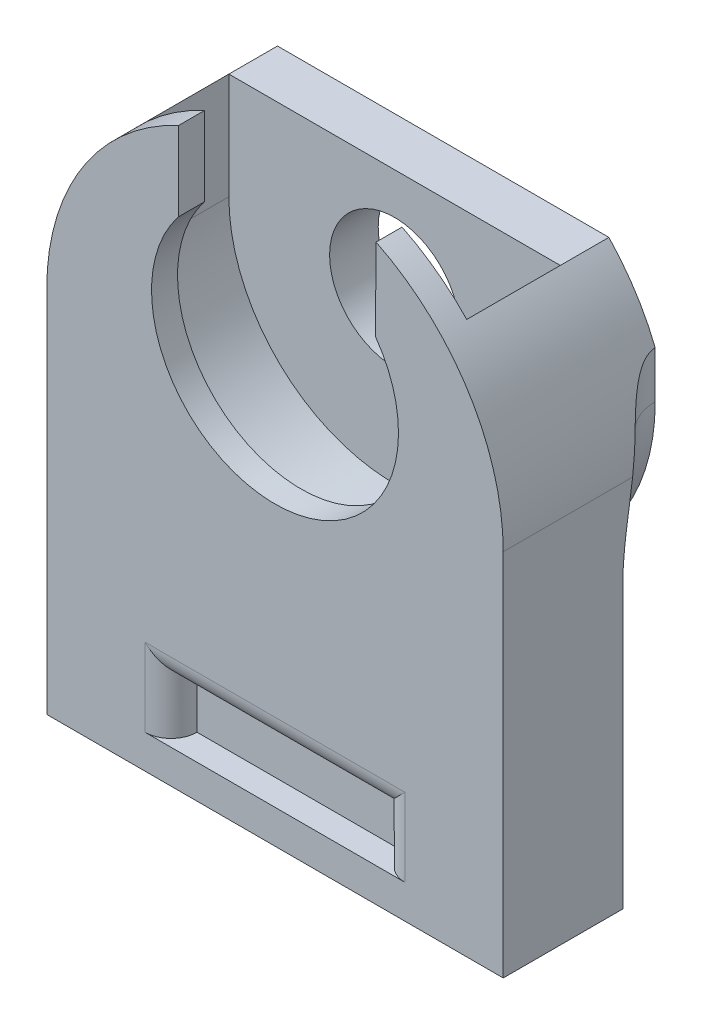
ISO-10303-21;
HEADER;
FILE_DESCRIPTION(('STEP AP214'),'2;1');
FILE_NAME('part.step','',(''),(''),'','','');
FILE_SCHEMA(('AUTOMOTIVE_DESIGN { 1 0 10303 214 1 1 1 1 }'));
ENDSEC;
DATA;
#1=APPLICATION_CONTEXT('core data for automotive mechanical design processes');
#2=APPLICATION_PROTOCOL_DEFINITION('international standard','automotive_design',2000,#1);
#3=PRODUCT_CONTEXT('',#1,'mechanical');
#4=PRODUCT('Part','Part','',(#3));
#5=PRODUCT_RELATED_PRODUCT_CATEGORY('part','',(#4));
#6=PRODUCT_DEFINITION_FORMATION('','',#4);
#7=PRODUCT_DEFINITION_CONTEXT('part definition',#1,'design');
#8=PRODUCT_DEFINITION('design','',#6,#7);
#9=PRODUCT_DEFINITION_SHAPE('','',#8);
#10=(LENGTH_UNIT() NAMED_UNIT(*) SI_UNIT(.MILLI.,.METRE.));
#11=(NAMED_UNIT(*) PLANE_ANGLE_UNIT() SI_UNIT($,.RADIAN.));
#12=(NAMED_UNIT(*) SI_UNIT($,.STERADIAN.) SOLID_ANGLE_UNIT());
#13=UNCERTAINTY_MEASURE_WITH_UNIT(LENGTH_MEASURE(1.E-05),#10,'distance_accuracy_value','');
#14=(GEOMETRIC_REPRESENTATION_CONTEXT(3) GLOBAL_UNCERTAINTY_ASSIGNED_CONTEXT((#13)) GLOBAL_UNIT_ASSIGNED_CONTEXT((#10,
#11,#12)) REPRESENTATION_CONTEXT('',''));
#15=CARTESIAN_POINT('',(0.,0.,0.));
#16=DIRECTION('',(0.,0.,1.));
#17=DIRECTION('',(1.,0.,0.));
#18=AXIS2_PLACEMENT_3D('',#15,#16,#17);
#19=CARTESIAN_POINT('',(8.78,8.5,3.6));
#20=DIRECTION('',(0.,0.,-1.));
#21=DIRECTION('',(-1.,0.,0.));
#22=AXIS2_PLACEMENT_3D('',#19,#20,#21);
#23=CYLINDRICAL_SURFACE('',#22,6.375);
#24=DIRECTION('',(0.,0.,-1.));
#25=VECTOR('',#24,1.);
#26=CARTESIAN_POINT('',(2.405,8.5,17.7427331163393));
#27=LINE('',#26,#25);
#28=CARTESIAN_POINT('',(2.405,8.5,3.6));
#29=VERTEX_POINT('',#28);
#30=CARTESIAN_POINT('',(2.405,8.5,0.));
#31=VERTEX_POINT('',#30);
#32=EDGE_CURVE('E245',#29,#31,#27,.T.);
#33=ORIENTED_EDGE('',*,*,#32,.F.);
#34=CARTESIAN_POINT('',(8.78,8.5,3.6));
#35=DIRECTION('',(0.,0.,1.));
#36=DIRECTION('',(1.,0.,0.));
#37=AXIS2_PLACEMENT_3D('',#34,#35,#36);
#38=CIRCLE('',#37,6.375);
#39=CARTESIAN_POINT('',(15.155,8.49999999999995,3.6));
#40=VERTEX_POINT('',#39);
#41=EDGE_CURVE('E264',#29,#40,#38,.T.);
#42=ORIENTED_EDGE('',*,*,#41,.T.);
#43=DIRECTION('',(0.,0.,-1.));
#44=VECTOR('',#43,1.);
#45=CARTESIAN_POINT('',(15.155,8.49999999999995,17.7427331163393));
#46=LINE('',#45,#44);
#47=CARTESIAN_POINT('',(15.155,8.49999999999995,0.));
#48=VERTEX_POINT('',#47);
#49=EDGE_CURVE('E250',#40,#48,#46,.T.);
#50=ORIENTED_EDGE('',*,*,#49,.T.);
#51=CARTESIAN_POINT('',(8.78,8.5,0.));
#52=DIRECTION('',(0.,0.,1.));
#53=DIRECTION('',(1.,0.,0.));
#54=AXIS2_PLACEMENT_3D('',#51,#52,#53);
#55=CIRCLE('',#54,6.375);
#56=EDGE_CURVE('E296',#31,#48,#55,.T.);
#57=ORIENTED_EDGE('',*,*,#56,.F.);
#58=EDGE_LOOP('',(#33,#42,#50,#57));
#59=FACE_BOUND('',#58,.T.);
#60=ADVANCED_FACE('F34',(#59),#23,.F.);
#61=CARTESIAN_POINT('',(0.,0.,0.));
#62=DIRECTION('',(0.,0.,1.));
#63=DIRECTION('',(1.,0.,0.));
#64=AXIS2_PLACEMENT_3D('',#61,#62,#63);
#65=PLANE('',#64);
#66=DIRECTION('',(1.,0.,0.));
#67=VECTOR('',#66,1.);
#68=CARTESIAN_POINT('',(0.,-1.87,0.));
#69=LINE('',#68,#67);
#70=CARTESIAN_POINT('',(8.62337998923574,-1.87,0.));
#71=VERTEX_POINT('',#70);
#72=CARTESIAN_POINT('',(8.93662001076427,-1.87,0.));
#73=VERTEX_POINT('',#72);
#74=EDGE_CURVE('E361',#71,#73,#69,.T.);
#75=ORIENTED_EDGE('',*,*,#74,.T.);
#76=CARTESIAN_POINT('',(8.93662001076427,8.,0.));
#77=DIRECTION('',(0.,0.,1.));
#78=DIRECTION('',(1.,0.,0.));
#79=AXIS2_PLACEMENT_3D('',#76,#77,#78);
#80=CIRCLE('',#79,9.87);
#81=CARTESIAN_POINT('',(17.56,3.19851923243998,0.));
#82=VERTEX_POINT('',#81);
#83=EDGE_CURVE('E210',#73,#82,#80,.T.);
#84=ORIENTED_EDGE('',*,*,#83,.T.);
#85=DIRECTION('',(0.,1.,0.));
#86=VECTOR('',#85,1.);
#87=CARTESIAN_POINT('',(17.56,0.,0.));
#88=LINE('',#87,#86);
#89=CARTESIAN_POINT('',(17.56,-7.65,0.));
#90=VERTEX_POINT('',#89);
#91=EDGE_CURVE('E300',#90,#82,#88,.T.);
#92=ORIENTED_EDGE('',*,*,#91,.F.);
#93=DIRECTION('',(1.,0.,0.));
#94=VECTOR('',#93,1.);
#95=CARTESIAN_POINT('',(0.,-7.65,0.));
#96=LINE('',#95,#94);
#97=CARTESIAN_POINT('',(0.,-7.65,0.));
#98=VERTEX_POINT('',#97);
#99=EDGE_CURVE('E320',#98,#90,#96,.T.);
#100=ORIENTED_EDGE('',*,*,#99,.F.);
#101=DIRECTION('',(0.,1.,0.));
#102=VECTOR('',#101,1.);
#103=CARTESIAN_POINT('',(0.,0.,0.));
#104=LINE('',#103,#102);
#105=CARTESIAN_POINT('',(0.,3.19851923243999,0.));
#106=VERTEX_POINT('',#105);
#107=EDGE_CURVE('E306',#98,#106,#104,.T.);
#108=ORIENTED_EDGE('',*,*,#107,.T.);
#109=CARTESIAN_POINT('',(8.62337998923574,8.,0.));
#110=DIRECTION('',(0.,0.,1.));
#111=DIRECTION('',(1.,0.,0.));
#112=AXIS2_PLACEMENT_3D('',#109,#110,#111);
#113=CIRCLE('',#112,9.87);
#114=EDGE_CURVE('E359',#106,#71,#113,.T.);
#115=ORIENTED_EDGE('',*,*,#114,.T.);
#116=EDGE_LOOP('',(#75,#84,#92,#100,#108,#115));
#117=FACE_BOUND('',#116,.T.);
#118=ADVANCED_FACE('F434',(#117),#65,.F.);
#119=CARTESIAN_POINT('',(0.,0.,3.6));
#120=DIRECTION('',(0.,0.,1.));
#121=DIRECTION('',(1.,0.,0.));
#122=AXIS2_PLACEMENT_3D('',#119,#120,#121);
#123=PLANE('',#122);
#124=ORIENTED_EDGE('',*,*,#41,.F.);
#125=DIRECTION('',(0.,1.,0.));
#126=VECTOR('',#125,1.);
#127=CARTESIAN_POINT('',(2.405,8.5,3.6));
#128=LINE('',#127,#126);
#129=CARTESIAN_POINT('',(2.405,12.5871992678725,3.6));
#130=VERTEX_POINT('',#129);
#131=EDGE_CURVE('E251',#29,#130,#128,.T.);
#132=ORIENTED_EDGE('',*,*,#131,.T.);
#133=CARTESIAN_POINT('',(8.78,6.55,3.6));
#134=DIRECTION('',(0.,0.,1.));
#135=DIRECTION('',(1.,0.,0.));
#136=AXIS2_PLACEMENT_3D('',#133,#134,#135);
#137=CIRCLE('',#136,8.78);
#138=CARTESIAN_POINT('',(5.07,14.5076566902575,3.6));
#139=VERTEX_POINT('',#138);
#140=EDGE_CURVE('E261',#139,#130,#137,.T.);
#141=ORIENTED_EDGE('',*,*,#140,.F.);
#142=DIRECTION('',(0.,1.,0.));
#143=VECTOR('',#142,1.);
#144=CARTESIAN_POINT('',(5.07,0.,3.6));
#145=LINE('',#144,#143);
#146=CARTESIAN_POINT('',(5.07,11.466209702634,3.6));
#147=VERTEX_POINT('',#146);
#148=EDGE_CURVE('E273',#147,#139,#145,.T.);
#149=ORIENTED_EDGE('',*,*,#148,.F.);
#150=CARTESIAN_POINT('',(8.78,8.5,3.6));
#151=DIRECTION('',(0.,0.,-1.));
#152=DIRECTION('',(-1.,0.,0.));
#153=AXIS2_PLACEMENT_3D('',#150,#151,#152);
#154=CIRCLE('',#153,4.75);
#155=CARTESIAN_POINT('',(12.642805753353,11.2642777920939,3.6));
#156=VERTEX_POINT('',#155);
#157=EDGE_CURVE('E302',#156,#147,#154,.T.);
#158=ORIENTED_EDGE('',*,*,#157,.F.);
#159=DIRECTION('',(-0.00807220354177865,-0.999967419234237,0.));
#160=VECTOR('',#159,1.);
#161=CARTESIAN_POINT('',(12.5510573615878,-0.101317990704999,3.6));
#162=LINE('',#161,#160);
#163=CARTESIAN_POINT('',(12.6682969564391,14.4220738549982,3.6));
#164=VERTEX_POINT('',#163);
#165=EDGE_CURVE('E339',#164,#156,#162,.T.);
#166=ORIENTED_EDGE('',*,*,#165,.F.);
#167=CARTESIAN_POINT('',(8.78,6.55,3.6));
#168=DIRECTION('',(0.,0.,1.));
#169=DIRECTION('',(1.,0.,0.));
#170=AXIS2_PLACEMENT_3D('',#167,#168,#169);
#171=CIRCLE('',#170,8.78);
#172=CARTESIAN_POINT('',(15.155,12.5871992678725,3.6));
#173=VERTEX_POINT('',#172);
#174=EDGE_CURVE('E258',#173,#164,#171,.T.);
#175=ORIENTED_EDGE('',*,*,#174,.F.);
#176=DIRECTION('',(0.,-1.,0.));
#177=VECTOR('',#176,1.);
#178=CARTESIAN_POINT('',(15.155,8.49999999999995,3.6));
#179=LINE('',#178,#177);
#180=EDGE_CURVE('E248',#173,#40,#179,.T.);
#181=ORIENTED_EDGE('',*,*,#180,.T.);
#182=EDGE_LOOP('',(#124,#132,#141,#149,#158,#166,#175,#181));
#183=FACE_BOUND('',#182,.T.);
#184=ADVANCED_FACE('F439',(#183),#123,.F.);
#185=CARTESIAN_POINT('',(0.,0.,4.6));
#186=DIRECTION('',(0.,0.,1.));
#187=DIRECTION('',(1.,0.,0.));
#188=AXIS2_PLACEMENT_3D('',#185,#186,#187);
#189=PLANE('',#188);
#190=DIRECTION('',(0.,1.,0.));
#191=VECTOR('',#190,1.);
#192=CARTESIAN_POINT('',(13.78,-6.35316683145248,4.6));
#193=LINE('',#192,#191);
#194=CARTESIAN_POINT('',(13.78,-3.35316683145248,4.6));
#195=VERTEX_POINT('',#194);
#196=CARTESIAN_POINT('',(13.78,-6.35316683145248,4.6));
#197=VERTEX_POINT('',#196);
#198=EDGE_CURVE('E293',#195,#197,#193,.F.);
#199=ORIENTED_EDGE('',*,*,#198,.T.);
#200=DIRECTION('',(1.,0.,0.));
#201=VECTOR('',#200,1.);
#202=CARTESIAN_POINT('',(12.78,-6.35316683145248,4.6));
#203=LINE('',#202,#201);
#204=CARTESIAN_POINT('',(3.78,-6.35316683145248,4.6));
#205=VERTEX_POINT('',#204);
#206=EDGE_CURVE('E286',#205,#197,#203,.T.);
#207=ORIENTED_EDGE('',*,*,#206,.F.);
#208=DIRECTION('',(0.,-1.,0.));
#209=VECTOR('',#208,1.);
#210=CARTESIAN_POINT('',(3.78,-4.35316683145248,4.6));
#211=LINE('',#210,#209);
#212=CARTESIAN_POINT('',(3.78,-3.35316683145248,4.6));
#213=VERTEX_POINT('',#212);
#214=EDGE_CURVE('E290',#205,#213,#211,.F.);
#215=ORIENTED_EDGE('',*,*,#214,.T.);
#216=DIRECTION('',(-1.,0.,0.));
#217=VECTOR('',#216,1.);
#218=CARTESIAN_POINT('',(12.78,-3.35316683145248,4.6));
#219=LINE('',#218,#217);
#220=EDGE_CURVE('E292',#213,#195,#219,.F.);
#221=ORIENTED_EDGE('',*,*,#220,.T.);
#222=EDGE_LOOP('',(#199,#207,#215,#221));
#223=FACE_BOUND('',#222,.T.);
#224=CARTESIAN_POINT('',(8.78,6.55,4.6));
#225=DIRECTION('',(0.,0.,1.));
#226=DIRECTION('',(1.,0.,0.));
#227=AXIS2_PLACEMENT_3D('',#224,#225,#226);
#228=CIRCLE('',#227,8.78);
#229=CARTESIAN_POINT('',(17.56,6.55,4.6));
#230=VERTEX_POINT('',#229);
#231=CARTESIAN_POINT('',(12.6682969564391,14.4220738549982,4.6));
#232=VERTEX_POINT('',#231);
#233=EDGE_CURVE('E298',#230,#232,#228,.T.);
#234=ORIENTED_EDGE('',*,*,#233,.T.);
#235=DIRECTION('',(-0.00807220354177865,-0.999967419234237,0.));
#236=VECTOR('',#235,1.);
#237=CARTESIAN_POINT('',(12.6696430470026,14.588824693216,4.6));
#238=LINE('',#237,#236);
#239=CARTESIAN_POINT('',(12.642805753353,11.2642777920939,4.6));
#240=VERTEX_POINT('',#239);
#241=EDGE_CURVE('E344',#232,#240,#238,.T.);
#242=ORIENTED_EDGE('',*,*,#241,.T.);
#243=CARTESIAN_POINT('',(8.78,8.5,4.6));
#244=DIRECTION('',(0.,0.,-1.));
#245=DIRECTION('',(-1.,0.,0.));
#246=AXIS2_PLACEMENT_3D('',#243,#244,#245);
#247=CIRCLE('',#246,4.75);
#248=CARTESIAN_POINT('',(5.07,11.466209702634,4.6));
#249=VERTEX_POINT('',#248);
#250=EDGE_CURVE('E316',#240,#249,#247,.T.);
#251=ORIENTED_EDGE('',*,*,#250,.T.);
#252=DIRECTION('',(0.,-1.,0.));
#253=VECTOR('',#252,1.);
#254=CARTESIAN_POINT('',(5.07,14.6194981256581,4.6));
#255=LINE('',#254,#253);
#256=CARTESIAN_POINT('',(5.07,14.5076566902575,4.6));
#257=VERTEX_POINT('',#256);
#258=EDGE_CURVE('E274',#257,#249,#255,.T.);
#259=ORIENTED_EDGE('',*,*,#258,.F.);
#260=CARTESIAN_POINT('',(8.78,6.55,4.6));
#261=DIRECTION('',(0.,0.,1.));
#262=DIRECTION('',(1.,0.,0.));
#263=AXIS2_PLACEMENT_3D('',#260,#261,#262);
#264=CIRCLE('',#263,8.78);
#265=CARTESIAN_POINT('',(0.,6.55,4.6));
#266=VERTEX_POINT('',#265);
#267=EDGE_CURVE('E314',#257,#266,#264,.T.);
#268=ORIENTED_EDGE('',*,*,#267,.T.);
#269=DIRECTION('',(0.,-1.,0.));
#270=VECTOR('',#269,1.);
#271=CARTESIAN_POINT('',(0.,0.,4.6));
#272=LINE('',#271,#270);
#273=CARTESIAN_POINT('',(0.,-7.65,4.6));
#274=VERTEX_POINT('',#273);
#275=EDGE_CURVE('E312',#266,#274,#272,.T.);
#276=ORIENTED_EDGE('',*,*,#275,.T.);
#277=DIRECTION('',(-1.,0.,0.));
#278=VECTOR('',#277,1.);
#279=CARTESIAN_POINT('',(17.56,-7.65,4.6));
#280=LINE('',#279,#278);
#281=CARTESIAN_POINT('',(17.56,-7.65,4.6));
#282=VERTEX_POINT('',#281);
#283=EDGE_CURVE('E305',#282,#274,#280,.T.);
#284=ORIENTED_EDGE('',*,*,#283,.F.);
#285=DIRECTION('',(0.,1.,0.));
#286=VECTOR('',#285,1.);
#287=CARTESIAN_POINT('',(17.56,0.,4.6));
#288=LINE('',#287,#286);
#289=EDGE_CURVE('E309',#282,#230,#288,.T.);
#290=ORIENTED_EDGE('',*,*,#289,.T.);
#291=EDGE_LOOP('',(#234,#242,#251,#259,#268,#276,#284,#290));
#292=FACE_BOUND('',#291,.T.);
#293=ADVANCED_FACE('F501',(#223,#292),#189,.T.);
#294=CARTESIAN_POINT('',(8.78,8.5,4.6));
#295=DIRECTION('',(0.,0.,-1.));
#296=DIRECTION('',(-1.,0.,0.));
#297=AXIS2_PLACEMENT_3D('',#294,#295,#296);
#298=CYLINDRICAL_SURFACE('',#297,4.75);
#299=DIRECTION('',(0.,0.,-1.));
#300=VECTOR('',#299,1.);
#301=CARTESIAN_POINT('',(12.642805753353,11.2642777920939,4.6));
#302=LINE('',#301,#300);
#303=EDGE_CURVE('E269',#156,#240,#302,.F.);
#304=ORIENTED_EDGE('',*,*,#303,.F.);
#305=ORIENTED_EDGE('',*,*,#157,.T.);
#306=DIRECTION('',(0.,0.,-1.));
#307=VECTOR('',#306,1.);
#308=CARTESIAN_POINT('',(5.07,11.466209702634,4.6));
#309=LINE('',#308,#307);
#310=EDGE_CURVE('E270',#249,#147,#309,.T.);
#311=ORIENTED_EDGE('',*,*,#310,.F.);
#312=ORIENTED_EDGE('',*,*,#250,.F.);
#313=EDGE_LOOP('',(#304,#305,#311,#312));
#314=FACE_BOUND('',#313,.T.);
#315=ADVANCED_FACE('F518',(#314),#298,.F.);
#316=CARTESIAN_POINT('',(8.78,6.55,3.6));
#317=DIRECTION('',(0.,0.,-1.));
#318=DIRECTION('',(-1.,0.,0.));
#319=AXIS2_PLACEMENT_3D('',#316,#317,#318);
#320=CYLINDRICAL_SURFACE('',#319,8.78);
#321=DIRECTION('',(0.,0.,-1.));
#322=VECTOR('',#321,1.);
#323=CARTESIAN_POINT('',(17.56,6.55,3.6));
#324=LINE('',#323,#322);
#325=CARTESIAN_POINT('',(17.56,6.55,-0.376678719483411));
#326=VERTEX_POINT('',#325);
#327=EDGE_CURVE('E59',#230,#326,#324,.T.);
#328=ORIENTED_EDGE('',*,*,#327,.T.);
#329=CARTESIAN_POINT('',(17.56,6.55,-0.376678719483445));
#330=CARTESIAN_POINT('',(17.5599995270757,6.66973610895043,-0.391645638041362));
#331=CARTESIAN_POINT('',(17.5575499078055,6.78937435326612,-0.407234810052966));
#332=CARTESIAN_POINT('',(17.5477796873859,7.02826719803863,-0.439768312180382));
#333=CARTESIAN_POINT('',(17.5404590764458,7.14752179772382,-0.456712645020031));
#334=CARTESIAN_POINT('',(17.5113769648211,7.50265410910789,-0.509480760214901));
#335=CARTESIAN_POINT('',(17.4824938257514,7.73769074975735,-0.547459631542807));
#336=CARTESIAN_POINT('',(17.4252609706734,8.08680776670218,-0.609613114176489));
#337=CARTESIAN_POINT('',(17.403878029386,8.20255597991153,-0.631184304066382));
#338=CARTESIAN_POINT('',(17.3565660020954,8.43274105437548,-0.676292366924847));
#339=CARTESIAN_POINT('',(17.3306370498483,8.54717795410703,-0.699829182048639));
#340=CARTESIAN_POINT('',(17.2741373097991,8.77529379375256,-0.749320808993638));
#341=CARTESIAN_POINT('',(17.2435341507939,8.88896117754392,-0.775291953461384));
#342=CARTESIAN_POINT('',(17.1779835134062,9.11438686910083,-0.829954321828415));
#343=CARTESIAN_POINT('',(17.1430355157161,9.22614494684141,-0.858645870780813));
#344=CARTESIAN_POINT('',(17.1059976167678,9.33678375292688,-0.888918915727635));
#345=B_SPLINE_CURVE_WITH_KNOTS('',3,(#329,#330,#331,#332,#333,#334,#335,#336,#337,#338,#339,
#340,#341,#342,#343,#344),.UNSPECIFIED.,.F.,.F.,(4,2,2,2,2,2,2,4),(0.,0.361937073233089,
0.723874873967965,1.44235518697129,1.80127359052817,2.16018143548794,2.52169816000887,
2.8832581356654),.UNSPECIFIED.);
#346=CARTESIAN_POINT('',(17.4394399357002,8.,-0.594179227968167));
#347=VERTEX_POINT('',#346);
#348=EDGE_CURVE('E420',#326,#347,#345,.T.);
#349=ORIENTED_EDGE('',*,*,#348,.T.);
#350=CARTESIAN_POINT('',(17.4394399357002,8.,-0.594179227968167));
#351=CARTESIAN_POINT('',(17.4240201477143,8.09216420853565,-0.610769682800152));
#352=CARTESIAN_POINT('',(17.4071539062772,8.18378186530015,-0.629385465180723));
#353=CARTESIAN_POINT('',(17.3707025917869,8.36571335312294,-0.671721198756279));
#354=CARTESIAN_POINT('',(17.3511058571361,8.45601965287677,-0.69546329646079));
#355=CARTESIAN_POINT('',(17.3092925575907,8.63521764844699,-0.749253197482276));
#356=CARTESIAN_POINT('',(17.2870509499401,8.72408498956349,-0.779363791823925));
#357=CARTESIAN_POINT('',(17.2406307952004,8.89823480536989,-0.847124893146833));
#358=CARTESIAN_POINT('',(17.2164562903784,8.98352422073453,-0.884759899634195));
#359=CARTESIAN_POINT('',(17.1743151520761,9.12440726977741,-0.956947590077173));
#360=CARTESIAN_POINT('',(17.1566336450916,9.18130636882367,-0.989104361592063));
#361=CARTESIAN_POINT('',(17.1211909344294,9.2915831086616,-1.05897252352583));
#362=CARTESIAN_POINT('',(17.1034297727723,9.34496241560316,-1.09668125810504));
#363=CARTESIAN_POINT('',(17.068373053547,9.44727853982594,-1.17904065527757));
#364=CARTESIAN_POINT('',(17.0510839156671,9.49616567799601,-1.22375687224273));
#365=CARTESIAN_POINT('',(17.01835071664,9.58648993397231,-1.32081708956083));
#366=CARTESIAN_POINT('',(17.0029026762309,9.62794322063841,-1.37314407567719));
#367=CARTESIAN_POINT('',(16.9803264253447,9.68746589313267,-1.46628621530755));
#368=CARTESIAN_POINT('',(16.972167404397,9.70866689956173,-1.50483604193031));
#369=CARTESIAN_POINT('',(16.9580262367225,9.74510049921371,-1.58495677437085));
#370=CARTESIAN_POINT('',(16.9520380978151,9.7603495304547,-1.62651897830711));
#371=CARTESIAN_POINT('',(16.9427979178744,9.78377433558673,-1.71214376232688));
#372=CARTESIAN_POINT('',(16.9395570966478,9.79192110827591,-1.75621581858425));
#373=CARTESIAN_POINT('',(16.937069836472,9.798170946207,-1.82316883061139));
#374=CARTESIAN_POINT('',(16.9366410219038,9.79924756714121,-1.84576223675738));
#375=CARTESIAN_POINT('',(16.9366004254851,9.79934870398349,-1.8909715245641));
#376=CARTESIAN_POINT('',(16.936989267409,9.79837165318533,-1.9135874102186));
#377=CARTESIAN_POINT('',(16.9377889452524,9.79636404685565,-1.93610936830708));
#378=B_SPLINE_CURVE_WITH_KNOTS('',3,(#350,#351,#352,#353,#354,#355,#356,#357,#358,#359,#360,
#361,#362,#363,#364,#365,#366,#367,#368,#369,#370,#371,#372,#373,#374,#375,#376,#377),
.UNSPECIFIED.,.F.,.F.,(4,2,2,2,2,2,2,2,2,2,2,2,2,4),(0.,0.284774455255104,0.570804717818058,
0.859798851394684,1.14820367212974,1.3510778292827,1.55385525288111,1.75865736940709,
1.96300848452012,2.09678631662166,2.23019202502451,2.36413996150232,2.43191291380336,
2.49973758753633),.UNSPECIFIED.);
#379=CARTESIAN_POINT('',(16.9366200107643,9.79929992459914,-1.87));
#380=VERTEX_POINT('',#379);
#381=EDGE_CURVE('E371',#347,#380,#378,.T.);
#382=ORIENTED_EDGE('',*,*,#381,.T.);
#383=CARTESIAN_POINT('',(8.78,6.55,-1.87));
#384=DIRECTION('',(0.,0.,-1.));
#385=DIRECTION('',(-1.,0.,0.));
#386=AXIS2_PLACEMENT_3D('',#383,#384,#385);
#387=CIRCLE('',#386,8.78);
#388=CARTESIAN_POINT('',(15.155,12.5871992678725,-1.87));
#389=VERTEX_POINT('',#388);
#390=EDGE_CURVE('E230',#389,#380,#387,.T.);
#391=ORIENTED_EDGE('',*,*,#390,.F.);
#392=DIRECTION('',(0.,0.,1.));
#393=VECTOR('',#392,1.);
#394=CARTESIAN_POINT('',(15.155,12.5871992678725,-1.87));
#395=LINE('',#394,#393);
#396=CARTESIAN_POINT('',(15.155,12.5871992678725,0.));
#397=VERTEX_POINT('',#396);
#398=EDGE_CURVE('E233',#389,#397,#395,.T.);
#399=ORIENTED_EDGE('',*,*,#398,.T.);
#400=DIRECTION('',(0.,0.,-1.));
#401=VECTOR('',#400,1.);
#402=CARTESIAN_POINT('',(15.155,12.5871992678725,3.6));
#403=LINE('',#402,#401);
#404=EDGE_CURVE('E356',#397,#173,#403,.F.);
#405=ORIENTED_EDGE('',*,*,#404,.T.);
#406=ORIENTED_EDGE('',*,*,#174,.T.);
#407=DIRECTION('',(0.,0.,-1.));
#408=VECTOR('',#407,1.);
#409=CARTESIAN_POINT('',(12.6682969564391,14.4220738549982,3.6));
#410=LINE('',#409,#408);
#411=EDGE_CURVE('E265',#232,#164,#410,.T.);
#412=ORIENTED_EDGE('',*,*,#411,.F.);
#413=ORIENTED_EDGE('',*,*,#233,.F.);
#414=EDGE_LOOP('',(#328,#349,#382,#391,#399,#405,#406,#412,#413));
#415=FACE_BOUND('',#414,.T.);
#416=ADVANCED_FACE('F456',(#415),#320,.T.);
#417=CARTESIAN_POINT('',(8.78,6.55,3.6));
#418=DIRECTION('',(0.,0.,-1.));
#419=DIRECTION('',(-1.,0.,0.));
#420=AXIS2_PLACEMENT_3D('',#417,#418,#419);
#421=CYLINDRICAL_SURFACE('',#420,8.78);
#422=DIRECTION('',(0.,0.,-1.));
#423=VECTOR('',#422,1.);
#424=CARTESIAN_POINT('',(5.07,14.5076566902575,3.6));
#425=LINE('',#424,#423);
#426=EDGE_CURVE('E282',#139,#257,#425,.F.);
#427=ORIENTED_EDGE('',*,*,#426,.F.);
#428=ORIENTED_EDGE('',*,*,#140,.T.);
#429=DIRECTION('',(0.,0.,-1.));
#430=VECTOR('',#429,1.);
#431=CARTESIAN_POINT('',(2.405,12.5871992678725,3.6));
#432=LINE('',#431,#430);
#433=CARTESIAN_POINT('',(2.405,12.5871992678725,0.));
#434=VERTEX_POINT('',#433);
#435=EDGE_CURVE('E268',#130,#434,#432,.T.);
#436=ORIENTED_EDGE('',*,*,#435,.T.);
#437=DIRECTION('',(0.,0.,1.));
#438=VECTOR('',#437,1.);
#439=CARTESIAN_POINT('',(2.405,12.5871992678725,-1.87));
#440=LINE('',#439,#438);
#441=CARTESIAN_POINT('',(2.405,12.5871992678725,-1.87));
#442=VERTEX_POINT('',#441);
#443=EDGE_CURVE('E239',#442,#434,#440,.T.);
#444=ORIENTED_EDGE('',*,*,#443,.F.);
#445=CARTESIAN_POINT('',(8.78,6.55,-1.87));
#446=DIRECTION('',(0.,0.,-1.));
#447=DIRECTION('',(-1.,0.,0.));
#448=AXIS2_PLACEMENT_3D('',#445,#446,#447);
#449=CIRCLE('',#448,8.78);
#450=CARTESIAN_POINT('',(0.623379989235738,9.79929992459915,-1.87));
#451=VERTEX_POINT('',#450);
#452=EDGE_CURVE('E225',#451,#442,#449,.T.);
#453=ORIENTED_EDGE('',*,*,#452,.F.);
#454=CARTESIAN_POINT('',(0.623033866597427,9.79843092869827,-1.90597747721005));
#455=CARTESIAN_POINT('',(0.623442370415403,9.79945524004539,-1.88486491867912));
#456=CARTESIAN_POINT('',(0.623488986768873,9.79957333133333,-1.86371294709691));
#457=CARTESIAN_POINT('',(0.622869677325945,9.79801902056514,-1.8214995317798));
#458=CARTESIAN_POINT('',(0.622204237176105,9.79634783885312,-1.80043803616791));
#459=CARTESIAN_POINT('',(0.619175760602193,9.78873130972242,-1.73799171700743));
#460=CARTESIAN_POINT('',(0.615787666868241,9.78020100906049,-1.69694431487049));
#461=CARTESIAN_POINT('',(0.606861429435906,9.75754443636021,-1.61906095887728));
#462=CARTESIAN_POINT('',(0.601443262867247,9.7437296639846,-1.58211698559553));
#463=CARTESIAN_POINT('',(0.588882073529437,9.71137469496746,-1.5106224332813));
#464=CARTESIAN_POINT('',(0.581735746814756,9.69282544299987,-1.4760766039021));
#465=CARTESIAN_POINT('',(0.561184095947379,9.63880865760174,-1.38846974900915));
#466=CARTESIAN_POINT('',(0.546695310160557,9.60009976900076,-1.33766582711242));
#467=CARTESIAN_POINT('',(0.515860515399868,9.51554115735401,-1.24306027886824));
#468=CARTESIAN_POINT('',(0.499509722294968,9.46967292223746,-1.19927741935774));
#469=CARTESIAN_POINT('',(0.468549646337193,9.38021074780859,-1.12401833757293));
#470=CARTESIAN_POINT('',(0.454042946530789,9.33729285201679,-1.09168023180533));
#471=CARTESIAN_POINT('',(0.424923284927993,9.24875421554112,-1.03096854349993));
#472=CARTESIAN_POINT('',(0.4103102502053,9.20313142835776,-1.00259801874435));
#473=CARTESIAN_POINT('',(0.366693047192659,9.06281405379796,-0.922442881584671));
#474=CARTESIAN_POINT('',(0.338032218213679,8.96501595520564,-0.875887225380067));
#475=CARTESIAN_POINT('',(0.291673343280348,8.79542483624635,-0.80618548230568));
#476=CARTESIAN_POINT('',(0.273316165724429,8.72489222036799,-0.780244543534506));
#477=CARTESIAN_POINT('',(0.238051384106603,8.58197497142031,-0.732664672577072));
#478=CARTESIAN_POINT('',(0.221144704815106,8.50958919448339,-0.711028473469209));
#479=CARTESIAN_POINT('',(0.189296706592987,8.36483024049467,-0.671804946148625));
#480=CARTESIAN_POINT('',(0.17432471621075,8.29248180111748,-0.65414987966602));
#481=CARTESIAN_POINT('',(0.146119753087781,8.14687817688715,-0.621954903643266));
#482=CARTESIAN_POINT('',(0.13288412886019,8.07362456594919,-0.607410222527541));
#483=CARTESIAN_POINT('',(0.120560064299782,8.00000000000022,-0.59417922796763));
#484=B_SPLINE_CURVE_WITH_KNOTS('',3,(#454,#455,#456,#457,#458,#459,#460,#461,#462,#463,#464,
#465,#466,#467,#468,#469,#470,#471,#472,#473,#474,#475,#476,#477,#478,#479,#480,#481,#482,#483),
.UNSPECIFIED.,.F.,.F.,(4,2,2,2,2,2,2,2,2,2,2,2,2,2,4),(0.,0.0633796509896781,0.126716102455131,
0.252203234505245,0.37121455038993,0.490455219733195,0.6858093216746,0.88167718861925,
1.04841938121939,1.21528938070553,1.55038452986147,1.78234431444937,2.01445090357376,
2.24224642434578,2.46968994140724),.UNSPECIFIED.);
#485=CARTESIAN_POINT('',(0.12056006429977,8.,-0.594179227968166));
#486=VERTEX_POINT('',#485);
#487=EDGE_CURVE('E364',#451,#486,#484,.T.);
#488=ORIENTED_EDGE('',*,*,#487,.T.);
#489=CARTESIAN_POINT('',(0.,6.55,-0.376678719483442));
#490=CARTESIAN_POINT('',(4.7292425595797E-07,6.66973610895043,-0.391645638041359));
#491=CARTESIAN_POINT('',(0.00245009219449367,6.78937435326612,-0.407234810052963));
#492=CARTESIAN_POINT('',(0.0122203126140926,7.02826719803863,-0.439768312180379));
#493=CARTESIAN_POINT('',(0.0195409235542289,7.14752179772382,-0.456712645020028));
#494=CARTESIAN_POINT('',(0.0486230351789418,7.50265410910789,-0.509480760214898));
#495=CARTESIAN_POINT('',(0.0775061742485578,7.73769074975735,-0.547459631542806));
#496=CARTESIAN_POINT('',(0.134739029326587,8.08680776670218,-0.609613114176486));
#497=CARTESIAN_POINT('',(0.156121970613994,8.20255597991153,-0.631184304066378));
#498=CARTESIAN_POINT('',(0.203433997904639,8.43274105437548,-0.676292366924842));
#499=CARTESIAN_POINT('',(0.229362950151703,8.54717795410702,-0.699829182048635));
#500=CARTESIAN_POINT('',(0.28586269020089,8.77529379375256,-0.749320808993634));
#501=CARTESIAN_POINT('',(0.31646584920608,8.88896117754391,-0.775291953461379));
#502=CARTESIAN_POINT('',(0.382016486593757,9.11438686910083,-0.829954321828409));
#503=CARTESIAN_POINT('',(0.416964484283867,9.22614494684141,-0.858645870780808));
#504=CARTESIAN_POINT('',(0.454002383232218,9.33678375292688,-0.888918915727629));
#505=B_SPLINE_CURVE_WITH_KNOTS('',3,(#489,#490,#491,#492,#493,#494,#495,#496,#497,#498,#499,
#500,#501,#502,#503,#504),.UNSPECIFIED.,.F.,.F.,(4,2,2,2,2,2,2,4),(0.,0.361937073233088,
0.723874873967965,1.44235518697129,1.80127359052817,2.16018143548793,2.52169816000886,
2.8832581356654),.UNSPECIFIED.);
#506=CARTESIAN_POINT('',(0.,6.55,-0.376678719483443));
#507=VERTEX_POINT('',#506);
#508=EDGE_CURVE('E44',#486,#507,#505,.F.);
#509=ORIENTED_EDGE('',*,*,#508,.T.);
#510=DIRECTION('',(0.,0.,-1.));
#511=VECTOR('',#510,1.);
#512=CARTESIAN_POINT('',(0.,6.55,3.6));
#513=LINE('',#512,#511);
#514=EDGE_CURVE('E51',#266,#507,#513,.T.);
#515=ORIENTED_EDGE('',*,*,#514,.F.);
#516=ORIENTED_EDGE('',*,*,#267,.F.);
#517=EDGE_LOOP('',(#427,#428,#436,#444,#453,#488,#509,#515,#516));
#518=FACE_BOUND('',#517,.T.);
#519=ADVANCED_FACE('F377',(#518),#421,.T.);
#520=CARTESIAN_POINT('',(0.,0.,3.6));
#521=DIRECTION('',(-1.,0.,0.));
#522=DIRECTION('',(0.,0.,1.));
#523=AXIS2_PLACEMENT_3D('',#520,#521,#522);
#524=PLANE('',#523);
#525=ORIENTED_EDGE('',*,*,#107,.F.);
#526=DIRECTION('',(0.,0.,-1.));
#527=VECTOR('',#526,1.);
#528=CARTESIAN_POINT('',(0.,-7.65,4.6));
#529=LINE('',#528,#527);
#530=EDGE_CURVE('E323',#274,#98,#529,.T.);
#531=ORIENTED_EDGE('',*,*,#530,.F.);
#532=ORIENTED_EDGE('',*,*,#275,.F.);
#533=ORIENTED_EDGE('',*,*,#514,.T.);
#534=CARTESIAN_POINT('',(0.,9.39003904696931,-0.384072071287627));
#535=CARTESIAN_POINT('',(0.,9.26197247969858,-0.399679876672791));
#536=CARTESIAN_POINT('',(0.,9.13369829176319,-0.413811896130697));
#537=CARTESIAN_POINT('',(0.,8.87674089038296,-0.438273971167934));
#538=CARTESIAN_POINT('',(0.,8.74805753520631,-0.448602520526506));
#539=CARTESIAN_POINT('',(0.,8.49087530581128,-0.464563406720382));
#540=CARTESIAN_POINT('',(0.,8.36237756611873,-0.470213307679686));
#541=CARTESIAN_POINT('',(0.,8.10527939970003,-0.476415158960912));
#542=CARTESIAN_POINT('',(0.,7.97667899515306,-0.476968010682018));
#543=CARTESIAN_POINT('',(0.,7.71973888293138,-0.472929977422504));
#544=CARTESIAN_POINT('',(0.,7.59139906063852,-0.468346202629178));
#545=CARTESIAN_POINT('',(0.,7.33497169591002,-0.454436527698084));
#546=CARTESIAN_POINT('',(0.,7.20688417842772,-0.445110180039807));
#547=CARTESIAN_POINT('',(0.,6.95095790706737,-0.422448494896422));
#548=CARTESIAN_POINT('',(0.,6.82311947918092,-0.409109570601237));
#549=CARTESIAN_POINT('',(0.,6.567792414861,-0.37938784685269));
#550=CARTESIAN_POINT('',(0.,6.44030381136241,-0.363004770148432));
#551=CARTESIAN_POINT('',(0.,6.05469186390594,-0.310403086097381));
#552=CARTESIAN_POINT('',(0.,5.79700314477878,-0.271106844605147));
#553=CARTESIAN_POINT('',(0.,5.28177246158251,-0.193214051394781));
#554=CARTESIAN_POINT('',(0.,5.02423057358671,-0.1546169029282));
#555=CARTESIAN_POINT('',(0.,4.50655667368445,-0.0860171930666329));
#556=CARTESIAN_POINT('',(0.,4.24641814952647,-0.0560589240822136));
#557=CARTESIAN_POINT('',(0.,3.85470519890904,-0.0238138818931742));
#558=CARTESIAN_POINT('',(0.,3.72367611172068,-0.0151773896515326));
#559=CARTESIAN_POINT('',(0.,3.4612888794633,-0.00327597100460445));
#560=CARTESIAN_POINT('',(0.,3.3299305672168,-1.48476736124362E-05));
#561=CARTESIAN_POINT('',(0.,3.19851923243999,0.));
#562=B_SPLINE_CURVE_WITH_KNOTS('',3,(#534,#535,#536,#537,#538,#539,#540,#541,#542,#543,#544,
#545,#546,#547,#548,#549,#550,#551,#552,#553,#554,#555,#556,#557,#558,#559,#560,#561),
.UNSPECIFIED.,.F.,.F.,(4,2,2,2,2,2,2,2,2,2,2,2,2,4),(0.,0.387075974620488,0.774305071644094,
1.16007379500537,1.54577429491654,1.93094156178833,2.31614518071016,2.70169415845081,
3.08727826788895,3.869240559263,4.65050050471543,5.43569758828807,5.82953676990201,
6.22365447338184),.UNSPECIFIED.);
#563=EDGE_CURVE('E11',#507,#106,#562,.T.);
#564=ORIENTED_EDGE('',*,*,#563,.T.);
#565=EDGE_LOOP('',(#525,#531,#532,#533,#564));
#566=FACE_BOUND('',#565,.T.);
#567=ADVANCED_FACE('F405',(#566),#524,.T.);
#568=CARTESIAN_POINT('',(17.56,0.,3.6));
#569=DIRECTION('',(-1.,0.,0.));
#570=DIRECTION('',(0.,0.,1.));
#571=AXIS2_PLACEMENT_3D('',#568,#569,#570);
#572=PLANE('',#571);
#573=ORIENTED_EDGE('',*,*,#91,.T.);
#574=CARTESIAN_POINT('',(17.56,9.39003904696959,-0.384072071287595));
#575=CARTESIAN_POINT('',(17.56,9.26197247969885,-0.399679876672762));
#576=CARTESIAN_POINT('',(17.56,9.13369829176346,-0.413811896130671));
#577=CARTESIAN_POINT('',(17.56,8.87674089038321,-0.438273971167915));
#578=CARTESIAN_POINT('',(17.56,8.74805753520656,-0.448602520526491));
#579=CARTESIAN_POINT('',(17.56,8.49087530581152,-0.464563406720374));
#580=CARTESIAN_POINT('',(17.56,8.36237756611896,-0.470213307679682));
#581=CARTESIAN_POINT('',(17.56,8.10527939970025,-0.476415158960913));
#582=CARTESIAN_POINT('',(17.56,7.97667899515328,-0.476968010682022));
#583=CARTESIAN_POINT('',(17.56,7.71973888293159,-0.472929977422513));
#584=CARTESIAN_POINT('',(17.56,7.59139906063872,-0.468346202629191));
#585=CARTESIAN_POINT('',(17.56,7.33497169591021,-0.454436527698101));
#586=CARTESIAN_POINT('',(17.56,7.20688417842791,-0.445110180039824));
#587=CARTESIAN_POINT('',(17.56,6.95095790706754,-0.422448494896442));
#588=CARTESIAN_POINT('',(17.56,6.82311947918108,-0.409109570601257));
#589=CARTESIAN_POINT('',(17.56,6.56779241486115,-0.379387846852712));
#590=CARTESIAN_POINT('',(17.56,6.44030381136256,-0.363004770148455));
#591=CARTESIAN_POINT('',(17.56,6.05469186390607,-0.310403086097404));
#592=CARTESIAN_POINT('',(17.56,5.7970031447789,-0.271106844605168));
#593=CARTESIAN_POINT('',(17.56,5.28177246158261,-0.193214051394797));
#594=CARTESIAN_POINT('',(17.56,5.02423057358679,-0.154616902928213));
#595=CARTESIAN_POINT('',(17.56,4.50655667368451,-0.0860171930666405));
#596=CARTESIAN_POINT('',(17.56,4.24641814952652,-0.0560589240822188));
#597=CARTESIAN_POINT('',(17.56,3.85470519890907,-0.0238138818931767));
#598=CARTESIAN_POINT('',(17.56,3.7236761117207,-0.0151773896515343));
#599=CARTESIAN_POINT('',(17.56,3.46128887946331,-0.00327597100460504));
#600=CARTESIAN_POINT('',(17.56,3.3299305672168,-1.48476736126511E-05));
#601=CARTESIAN_POINT('',(17.56,3.19851923243998,0.));
#602=B_SPLINE_CURVE_WITH_KNOTS('',3,(#574,#575,#576,#577,#578,#579,#580,#581,#582,#583,#584,
#585,#586,#587,#588,#589,#590,#591,#592,#593,#594,#595,#596,#597,#598,#599,#600,#601),
.UNSPECIFIED.,.F.,.F.,(4,2,2,2,2,2,2,2,2,2,2,2,2,4),(0.,0.387075974620505,0.774305071644128,
1.16007379500542,1.54577429491661,1.93094156178841,2.31614518071026,2.70169415845093,
3.08727826788908,3.86924055926318,4.65050050471564,5.43569758828831,5.82953676990228,
6.22365447338213),.UNSPECIFIED.);
#603=EDGE_CURVE('E416',#82,#326,#602,.F.);
#604=ORIENTED_EDGE('',*,*,#603,.T.);
#605=ORIENTED_EDGE('',*,*,#327,.F.);
#606=ORIENTED_EDGE('',*,*,#289,.F.);
#607=DIRECTION('',(0.,0.,1.));
#608=VECTOR('',#607,1.);
#609=CARTESIAN_POINT('',(17.56,-7.65,0.));
#610=LINE('',#609,#608);
#611=EDGE_CURVE('E317',#90,#282,#610,.T.);
#612=ORIENTED_EDGE('',*,*,#611,.F.);
#613=EDGE_LOOP('',(#573,#604,#605,#606,#612));
#614=FACE_BOUND('',#613,.T.);
#615=ADVANCED_FACE('F409',(#614),#572,.F.);
#616=CARTESIAN_POINT('',(0.,-7.65,0.));
#617=DIRECTION('',(0.,-1.,0.));
#618=DIRECTION('',(0.,0.,-1.));
#619=AXIS2_PLACEMENT_3D('',#616,#617,#618);
#620=PLANE('',#619);
#621=ORIENTED_EDGE('',*,*,#283,.T.);
#622=ORIENTED_EDGE('',*,*,#530,.T.);
#623=ORIENTED_EDGE('',*,*,#99,.T.);
#624=ORIENTED_EDGE('',*,*,#611,.T.);
#625=EDGE_LOOP('',(#621,#622,#623,#624));
#626=FACE_BOUND('',#625,.T.);
#627=ADVANCED_FACE('F413',(#626),#620,.T.);
#628=CARTESIAN_POINT('',(12.78,-6.35316683145248,3.6));
#629=DIRECTION('',(0.,-1.,0.));
#630=DIRECTION('',(1.,0.,0.));
#631=AXIS2_PLACEMENT_3D('',#628,#629,#630);
#632=PLANE('',#631);
#633=ORIENTED_EDGE('',*,*,#206,.T.);
#634=CARTESIAN_POINT('',(13.78,-6.35316683145248,3.6));
#635=DIRECTION('',(0.,-1.,0.));
#636=DIRECTION('',(1.,0.,0.));
#637=AXIS2_PLACEMENT_3D('',#634,#635,#636);
#638=CIRCLE('',#637,1.);
#639=CARTESIAN_POINT('',(12.78,-6.35316683145248,3.6));
#640=VERTEX_POINT('',#639);
#641=EDGE_CURVE('E283',#197,#640,#638,.T.);
#642=ORIENTED_EDGE('',*,*,#641,.T.);
#643=DIRECTION('',(1.,0.,0.));
#644=VECTOR('',#643,1.);
#645=CARTESIAN_POINT('',(12.78,-6.35316683145248,3.6));
#646=LINE('',#645,#644);
#647=CARTESIAN_POINT('',(4.78,-6.35316683145248,3.6));
#648=VERTEX_POINT('',#647);
#649=EDGE_CURVE('E279',#648,#640,#646,.T.);
#650=ORIENTED_EDGE('',*,*,#649,.F.);
#651=CARTESIAN_POINT('',(3.78,-6.35316683145248,3.6));
#652=DIRECTION('',(0.,-1.,0.));
#653=DIRECTION('',(1.,0.,0.));
#654=AXIS2_PLACEMENT_3D('',#651,#652,#653);
#655=CIRCLE('',#654,1.);
#656=EDGE_CURVE('E285',#648,#205,#655,.T.);
#657=ORIENTED_EDGE('',*,*,#656,.T.);
#658=EDGE_LOOP('',(#633,#642,#650,#657));
#659=FACE_BOUND('',#658,.T.);
#660=ADVANCED_FACE('F507',(#659),#632,.F.);
#661=CARTESIAN_POINT('',(0.,0.,3.6));
#662=DIRECTION('',(0.,0.,1.));
#663=DIRECTION('',(1.,0.,0.));
#664=AXIS2_PLACEMENT_3D('',#661,#662,#663);
#665=PLANE('',#664);
#666=DIRECTION('',(0.,1.,0.));
#667=VECTOR('',#666,1.);
#668=CARTESIAN_POINT('',(12.78,-6.35316683145248,3.6));
#669=LINE('',#668,#667);
#670=CARTESIAN_POINT('',(12.78,-4.35316683145248,3.6));
#671=VERTEX_POINT('',#670);
#672=EDGE_CURVE('E289',#640,#671,#669,.T.);
#673=ORIENTED_EDGE('',*,*,#672,.T.);
#674=DIRECTION('',(-1.,0.,0.));
#675=VECTOR('',#674,1.);
#676=CARTESIAN_POINT('',(12.78,-4.35316683145248,3.6));
#677=LINE('',#676,#675);
#678=CARTESIAN_POINT('',(4.78,-4.35316683145248,3.6));
#679=VERTEX_POINT('',#678);
#680=EDGE_CURVE('E334',#671,#679,#677,.T.);
#681=ORIENTED_EDGE('',*,*,#680,.T.);
#682=DIRECTION('',(0.,-1.,0.));
#683=VECTOR('',#682,1.);
#684=CARTESIAN_POINT('',(4.78,-6.35316683145248,3.6));
#685=LINE('',#684,#683);
#686=EDGE_CURVE('E331',#679,#648,#685,.T.);
#687=ORIENTED_EDGE('',*,*,#686,.T.);
#688=ORIENTED_EDGE('',*,*,#649,.T.);
#689=EDGE_LOOP('',(#673,#681,#687,#688));
#690=FACE_BOUND('',#689,.T.);
#691=ADVANCED_FACE('F480',(#690),#665,.T.);
#692=CARTESIAN_POINT('',(13.78,-6.35316683145248,3.6));
#693=DIRECTION('',(0.,-1.,0.));
#694=DIRECTION('',(0.,0.,-1.));
#695=AXIS2_PLACEMENT_3D('',#692,#693,#694);
#696=CYLINDRICAL_SURFACE('',#695,1.);
#697=ORIENTED_EDGE('',*,*,#641,.F.);
#698=ORIENTED_EDGE('',*,*,#198,.F.);
#699=CARTESIAN_POINT('',(13.78,-3.35316683145248,3.6));
#700=DIRECTION('',(0.707106781186547,-0.707106781186547,0.));
#701=DIRECTION('',(-0.707106781186547,-0.707106781186547,0.));
#702=AXIS2_PLACEMENT_3D('',#699,#700,#701);
#703=ELLIPSE('',#702,1.41421356237309,1.);
#704=EDGE_CURVE('E275',#671,#195,#703,.F.);
#705=ORIENTED_EDGE('',*,*,#704,.F.);
#706=ORIENTED_EDGE('',*,*,#672,.F.);
#707=EDGE_LOOP('',(#697,#698,#705,#706));
#708=FACE_BOUND('',#707,.T.);
#709=ADVANCED_FACE('F476',(#708),#696,.T.);
#710=CARTESIAN_POINT('',(12.78,-3.35316683145248,3.6));
#711=DIRECTION('',(1.,0.,0.));
#712=DIRECTION('',(0.,0.,-1.));
#713=AXIS2_PLACEMENT_3D('',#710,#711,#712);
#714=CYLINDRICAL_SURFACE('',#713,1.);
#715=ORIENTED_EDGE('',*,*,#704,.T.);
#716=ORIENTED_EDGE('',*,*,#220,.F.);
#717=CARTESIAN_POINT('',(3.78,-3.35316683145248,3.6));
#718=DIRECTION('',(0.707106781186547,0.707106781186547,0.));
#719=DIRECTION('',(-0.707106781186547,0.707106781186547,0.));
#720=AXIS2_PLACEMENT_3D('',#717,#718,#719);
#721=ELLIPSE('',#720,1.41421356237309,1.);
#722=EDGE_CURVE('E278',#679,#213,#721,.F.);
#723=ORIENTED_EDGE('',*,*,#722,.F.);
#724=ORIENTED_EDGE('',*,*,#680,.F.);
#725=EDGE_LOOP('',(#715,#716,#723,#724));
#726=FACE_BOUND('',#725,.T.);
#727=ADVANCED_FACE('F479',(#726),#714,.T.);
#728=CARTESIAN_POINT('',(3.78,-6.35316683145248,3.6));
#729=DIRECTION('',(0.,1.,0.));
#730=DIRECTION('',(0.,0.,1.));
#731=AXIS2_PLACEMENT_3D('',#728,#729,#730);
#732=CYLINDRICAL_SURFACE('',#731,1.);
#733=ORIENTED_EDGE('',*,*,#722,.T.);
#734=ORIENTED_EDGE('',*,*,#214,.F.);
#735=ORIENTED_EDGE('',*,*,#656,.F.);
#736=ORIENTED_EDGE('',*,*,#686,.F.);
#737=EDGE_LOOP('',(#733,#734,#735,#736));
#738=FACE_BOUND('',#737,.T.);
#739=ADVANCED_FACE('F483',(#738),#732,.T.);
#740=CARTESIAN_POINT('',(5.07,0.,0.));
#741=DIRECTION('',(1.,0.,0.));
#742=DIRECTION('',(0.,0.,-1.));
#743=AXIS2_PLACEMENT_3D('',#740,#741,#742);
#744=PLANE('',#743);
#745=ORIENTED_EDGE('',*,*,#148,.T.);
#746=ORIENTED_EDGE('',*,*,#426,.T.);
#747=ORIENTED_EDGE('',*,*,#258,.T.);
#748=ORIENTED_EDGE('',*,*,#310,.T.);
#749=EDGE_LOOP('',(#745,#746,#747,#748));
#750=FACE_BOUND('',#749,.T.);
#751=ADVANCED_FACE('F486',(#750),#744,.T.);
#752=CARTESIAN_POINT('',(12.5516314824536,-0.0301971179980865,0.));
#753=DIRECTION('',(-0.999967419234237,0.00807220354177865,0.));
#754=DIRECTION('',(0.,0.,-1.));
#755=AXIS2_PLACEMENT_3D('',#752,#753,#754);
#756=PLANE('',#755);
#757=ORIENTED_EDGE('',*,*,#411,.T.);
#758=ORIENTED_EDGE('',*,*,#165,.T.);
#759=ORIENTED_EDGE('',*,*,#303,.T.);
#760=ORIENTED_EDGE('',*,*,#241,.F.);
#761=EDGE_LOOP('',(#757,#758,#759,#760));
#762=FACE_BOUND('',#761,.T.);
#763=ADVANCED_FACE('F473',(#762),#756,.T.);
#764=CARTESIAN_POINT('',(15.155,8.49999999999995,17.7427331163393));
#765=DIRECTION('',(1.,0.,0.));
#766=DIRECTION('',(0.,0.,-1.));
#767=AXIS2_PLACEMENT_3D('',#764,#765,#766);
#768=PLANE('',#767);
#769=DIRECTION('',(0.,-1.,0.));
#770=VECTOR('',#769,1.);
#771=CARTESIAN_POINT('',(15.155,8.49999999999995,0.));
#772=LINE('',#771,#770);
#773=EDGE_CURVE('E241',#397,#48,#772,.T.);
#774=ORIENTED_EDGE('',*,*,#773,.T.);
#775=ORIENTED_EDGE('',*,*,#49,.F.);
#776=ORIENTED_EDGE('',*,*,#180,.F.);
#777=ORIENTED_EDGE('',*,*,#404,.F.);
#778=EDGE_LOOP('',(#774,#775,#776,#777));
#779=FACE_BOUND('',#778,.T.);
#780=ADVANCED_FACE('F451',(#779),#768,.F.);
#781=CARTESIAN_POINT('',(2.405,8.5,17.7427331163393));
#782=DIRECTION('',(-1.,0.,0.));
#783=DIRECTION('',(0.,-1.,0.));
#784=AXIS2_PLACEMENT_3D('',#781,#782,#783);
#785=PLANE('',#784);
#786=ORIENTED_EDGE('',*,*,#131,.F.);
#787=ORIENTED_EDGE('',*,*,#32,.T.);
#788=DIRECTION('',(0.,1.,0.));
#789=VECTOR('',#788,1.);
#790=CARTESIAN_POINT('',(2.405,8.5,0.));
#791=LINE('',#790,#789);
#792=EDGE_CURVE('E242',#31,#434,#791,.T.);
#793=ORIENTED_EDGE('',*,*,#792,.T.);
#794=ORIENTED_EDGE('',*,*,#435,.F.);
#795=EDGE_LOOP('',(#786,#787,#793,#794));
#796=FACE_BOUND('',#795,.T.);
#797=ADVANCED_FACE('F465',(#796),#785,.F.);
#798=CARTESIAN_POINT('',(0.,12.5871992678725,-1.87));
#799=DIRECTION('',(0.,1.,0.));
#800=DIRECTION('',(-1.,0.,0.));
#801=AXIS2_PLACEMENT_3D('',#798,#799,#800);
#802=PLANE('',#801);
#803=DIRECTION('',(-1.,0.,0.));
#804=VECTOR('',#803,1.);
#805=CARTESIAN_POINT('',(0.,12.5871992678725,0.));
#806=LINE('',#805,#804);
#807=EDGE_CURVE('E203',#397,#434,#806,.T.);
#808=ORIENTED_EDGE('',*,*,#807,.F.);
#809=ORIENTED_EDGE('',*,*,#398,.F.);
#810=DIRECTION('',(-1.,0.,0.));
#811=VECTOR('',#810,1.);
#812=CARTESIAN_POINT('',(0.,12.5871992678725,-1.87));
#813=LINE('',#812,#811);
#814=EDGE_CURVE('E227',#389,#442,#813,.T.);
#815=ORIENTED_EDGE('',*,*,#814,.T.);
#816=ORIENTED_EDGE('',*,*,#443,.T.);
#817=EDGE_LOOP('',(#808,#809,#815,#816));
#818=FACE_BOUND('',#817,.T.);
#819=ADVANCED_FACE('F459',(#818),#802,.T.);
#820=CARTESIAN_POINT('',(0.,0.,-1.87));
#821=DIRECTION('',(0.,0.,-1.));
#822=DIRECTION('',(-1.,0.,0.));
#823=AXIS2_PLACEMENT_3D('',#820,#821,#822);
#824=PLANE('',#823);
#825=CARTESIAN_POINT('',(8.78,8.5,-1.87));
#826=DIRECTION('',(0.,0.,-1.));
#827=DIRECTION('',(-1.,0.,0.));
#828=AXIS2_PLACEMENT_3D('',#825,#826,#827);
#829=CIRCLE('',#828,2.5);
#830=CARTESIAN_POINT('',(6.28,8.5,-1.87));
#831=VERTEX_POINT('',#830);
#832=EDGE_CURVE('E725',#831,#831,#829,.T.);
#833=ORIENTED_EDGE('',*,*,#832,.F.);
#834=EDGE_LOOP('',(#833));
#835=FACE_BOUND('',#834,.T.);
#836=CARTESIAN_POINT('',(8.93662001076427,8.,-1.87));
#837=DIRECTION('',(0.,0.,-1.));
#838=DIRECTION('',(-1.,0.,0.));
#839=AXIS2_PLACEMENT_3D('',#836,#837,#838);
#840=CIRCLE('',#839,8.);
#841=CARTESIAN_POINT('',(8.93662001076427,0.,-1.87));
#842=VERTEX_POINT('',#841);
#843=CARTESIAN_POINT('',(16.9366200107643,8.,-1.87));
#844=VERTEX_POINT('',#843);
#845=EDGE_CURVE('E191',#842,#844,#840,.F.);
#846=ORIENTED_EDGE('',*,*,#845,.F.);
#847=DIRECTION('',(1.,0.,0.));
#848=VECTOR('',#847,1.);
#849=CARTESIAN_POINT('',(0.,0.,-1.87));
#850=LINE('',#849,#848);
#851=CARTESIAN_POINT('',(8.62337998923574,0.,-1.87));
#852=VERTEX_POINT('',#851);
#853=EDGE_CURVE('E195',#852,#842,#850,.T.);
#854=ORIENTED_EDGE('',*,*,#853,.F.);
#855=CARTESIAN_POINT('',(8.62337998923574,8.,-1.87));
#856=DIRECTION('',(0.,0.,-1.));
#857=DIRECTION('',(-1.,0.,0.));
#858=AXIS2_PLACEMENT_3D('',#855,#856,#857);
#859=CIRCLE('',#858,8.);
#860=CARTESIAN_POINT('',(0.623379989235737,8.,-1.87));
#861=VERTEX_POINT('',#860);
#862=EDGE_CURVE('E217',#861,#852,#859,.F.);
#863=ORIENTED_EDGE('',*,*,#862,.F.);
#864=DIRECTION('',(0.,-1.,0.));
#865=VECTOR('',#864,1.);
#866=CARTESIAN_POINT('',(0.62337998923574,0.,-1.87));
#867=LINE('',#866,#865);
#868=EDGE_CURVE('E219',#451,#861,#867,.T.);
#869=ORIENTED_EDGE('',*,*,#868,.F.);
#870=ORIENTED_EDGE('',*,*,#452,.T.);
#871=ORIENTED_EDGE('',*,*,#814,.F.);
#872=ORIENTED_EDGE('',*,*,#390,.T.);
#873=DIRECTION('',(0.,1.,0.));
#874=VECTOR('',#873,1.);
#875=CARTESIAN_POINT('',(16.9366200107643,0.,-1.87));
#876=LINE('',#875,#874);
#877=EDGE_CURVE('E199',#844,#380,#876,.T.);
#878=ORIENTED_EDGE('',*,*,#877,.F.);
#879=EDGE_LOOP('',(#846,#854,#863,#869,#870,#871,#872,#878));
#880=FACE_BOUND('',#879,.T.);
#881=ADVANCED_FACE('F193',(#835,#880),#824,.T.);
#882=CARTESIAN_POINT('',(0.,0.,0.));
#883=DIRECTION('',(0.,0.,-1.));
#884=DIRECTION('',(-1.,0.,0.));
#885=AXIS2_PLACEMENT_3D('',#882,#883,#884);
#886=PLANE('',#885);
#887=CARTESIAN_POINT('',(8.78,8.5,0.));
#888=DIRECTION('',(0.,0.,-1.));
#889=DIRECTION('',(-1.,0.,0.));
#890=AXIS2_PLACEMENT_3D('',#887,#888,#889);
#891=CIRCLE('',#890,2.5);
#892=CARTESIAN_POINT('',(6.28,8.5,0.));
#893=VERTEX_POINT('',#892);
#894=EDGE_CURVE('E236',#893,#893,#891,.F.);
#895=ORIENTED_EDGE('',*,*,#894,.F.);
#896=EDGE_LOOP('',(#895));
#897=FACE_BOUND('',#896,.T.);
#898=ORIENTED_EDGE('',*,*,#792,.F.);
#899=ORIENTED_EDGE('',*,*,#56,.T.);
#900=ORIENTED_EDGE('',*,*,#773,.F.);
#901=ORIENTED_EDGE('',*,*,#807,.T.);
#902=EDGE_LOOP('',(#898,#899,#900,#901));
#903=FACE_BOUND('',#902,.T.);
#904=ADVANCED_FACE('F453',(#897,#903),#886,.F.);
#905=CARTESIAN_POINT('',(8.78,8.5,4.601));
#906=DIRECTION('',(0.,0.,-1.));
#907=DIRECTION('',(-1.,0.,0.));
#908=AXIS2_PLACEMENT_3D('',#905,#906,#907);
#909=CYLINDRICAL_SURFACE('',#908,2.5);
#910=ORIENTED_EDGE('',*,*,#832,.T.);
#911=EDGE_LOOP('',(#910));
#912=FACE_BOUND('',#911,.T.);
#913=ORIENTED_EDGE('',*,*,#894,.T.);
#914=EDGE_LOOP('',(#913));
#915=FACE_BOUND('',#914,.T.);
#916=ADVANCED_FACE('F431',(#912,#915),#909,.F.);
#917=CARTESIAN_POINT('',(18.8066200107643,0.,-1.87));
#918=DIRECTION('',(0.,1.,0.));
#919=DIRECTION('',(0.,0.,1.));
#920=AXIS2_PLACEMENT_3D('',#917,#918,#919);
#921=CYLINDRICAL_SURFACE('',#920,1.87);
#922=ORIENTED_EDGE('',*,*,#877,.T.);
#923=ORIENTED_EDGE('',*,*,#381,.F.);
#924=CARTESIAN_POINT('',(18.8066200107643,8.,-1.87));
#925=DIRECTION('',(0.,1.,0.));
#926=DIRECTION('',(0.,0.,1.));
#927=AXIS2_PLACEMENT_3D('',#924,#925,#926);
#928=CIRCLE('',#927,1.87);
#929=EDGE_CURVE('E39',#844,#347,#928,.T.);
#930=ORIENTED_EDGE('',*,*,#929,.F.);
#931=EDGE_LOOP('',(#922,#923,#930));
#932=FACE_BOUND('',#931,.T.);
#933=ADVANCED_FACE('F36',(#932),#921,.F.);
#934=CARTESIAN_POINT('',(8.93662001076427,8.,-1.87));
#935=DIRECTION('',(0.,0.,1.));
#936=DIRECTION('',(1.,0.,0.));
#937=AXIS2_PLACEMENT_3D('',#934,#935,#936);
#938=TOROIDAL_SURFACE('',#937,9.87,1.87);
#939=ORIENTED_EDGE('',*,*,#603,.F.);
#940=ORIENTED_EDGE('',*,*,#83,.F.);
#941=CARTESIAN_POINT('',(8.93662001076427,-1.87,-1.87));
#942=DIRECTION('',(1.,0.,0.));
#943=DIRECTION('',(0.,0.,-1.));
#944=AXIS2_PLACEMENT_3D('',#941,#942,#943);
#945=CIRCLE('',#944,1.87);
#946=EDGE_CURVE('E207',#842,#73,#945,.T.);
#947=ORIENTED_EDGE('',*,*,#946,.F.);
#948=ORIENTED_EDGE('',*,*,#845,.T.);
#949=ORIENTED_EDGE('',*,*,#929,.T.);
#950=ORIENTED_EDGE('',*,*,#348,.F.);
#951=EDGE_LOOP('',(#939,#940,#947,#948,#949,#950));
#952=FACE_BOUND('',#951,.T.);
#953=ADVANCED_FACE('F209',(#952),#938,.F.);
#954=CARTESIAN_POINT('',(0.,-1.87,-1.87));
#955=DIRECTION('',(1.,0.,0.));
#956=DIRECTION('',(0.,1.,0.));
#957=AXIS2_PLACEMENT_3D('',#954,#955,#956);
#958=CYLINDRICAL_SURFACE('',#957,1.87);
#959=ORIENTED_EDGE('',*,*,#946,.T.);
#960=ORIENTED_EDGE('',*,*,#74,.F.);
#961=CARTESIAN_POINT('',(8.62337998923574,-1.87,-1.87));
#962=DIRECTION('',(1.,0.,0.));
#963=DIRECTION('',(0.,0.,-1.));
#964=AXIS2_PLACEMENT_3D('',#961,#962,#963);
#965=CIRCLE('',#964,1.87);
#966=EDGE_CURVE('E213',#852,#71,#965,.T.);
#967=ORIENTED_EDGE('',*,*,#966,.F.);
#968=ORIENTED_EDGE('',*,*,#853,.T.);
#969=EDGE_LOOP('',(#959,#960,#967,#968));
#970=FACE_BOUND('',#969,.T.);
#971=ADVANCED_FACE('F214',(#970),#958,.F.);
#972=CARTESIAN_POINT('',(8.62337998923574,8.,-1.87));
#973=DIRECTION('',(0.,0.,1.));
#974=DIRECTION('',(1.,0.,0.));
#975=AXIS2_PLACEMENT_3D('',#972,#973,#974);
#976=TOROIDAL_SURFACE('',#975,9.87,1.87);
#977=ORIENTED_EDGE('',*,*,#563,.F.);
#978=ORIENTED_EDGE('',*,*,#508,.F.);
#979=CARTESIAN_POINT('',(-1.24662001076426,8.,-1.87));
#980=DIRECTION('',(0.,-1.,0.));
#981=DIRECTION('',(0.,0.,-1.));
#982=AXIS2_PLACEMENT_3D('',#979,#980,#981);
#983=CIRCLE('',#982,1.87);
#984=EDGE_CURVE('E403',#861,#486,#983,.T.);
#985=ORIENTED_EDGE('',*,*,#984,.F.);
#986=ORIENTED_EDGE('',*,*,#862,.T.);
#987=ORIENTED_EDGE('',*,*,#966,.T.);
#988=ORIENTED_EDGE('',*,*,#114,.F.);
#989=EDGE_LOOP('',(#977,#978,#985,#986,#987,#988));
#990=FACE_BOUND('',#989,.T.);
#991=ADVANCED_FACE('F386',(#990),#976,.F.);
#992=CARTESIAN_POINT('',(-1.24662001076426,0.,-1.87));
#993=DIRECTION('',(0.,-1.,0.));
#994=DIRECTION('',(1.,0.,0.));
#995=AXIS2_PLACEMENT_3D('',#992,#993,#994);
#996=CYLINDRICAL_SURFACE('',#995,1.87);
#997=ORIENTED_EDGE('',*,*,#487,.F.);
#998=ORIENTED_EDGE('',*,*,#868,.T.);
#999=ORIENTED_EDGE('',*,*,#984,.T.);
#1000=EDGE_LOOP('',(#997,#998,#999));
#1001=FACE_BOUND('',#1000,.T.);
#1002=ADVANCED_FACE('F381',(#1001),#996,.F.);
#1003=CLOSED_SHELL('',(#60,#118,#184,#293,#315,#416,#519,#567,#615,#627,#660,#691,#709,#727,
#739,#751,#763,#780,#797,#819,#881,#904,#916,#933,#953,#971,#991,#1002));
#1004=MANIFOLD_SOLID_BREP('B2',#1003);
#1005=ADVANCED_BREP_SHAPE_REPRESENTATION('',(#18,#1004),#14);
#1006=SHAPE_DEFINITION_REPRESENTATION(#9,#1005);
ENDSEC;
END-ISO-10303-21;
